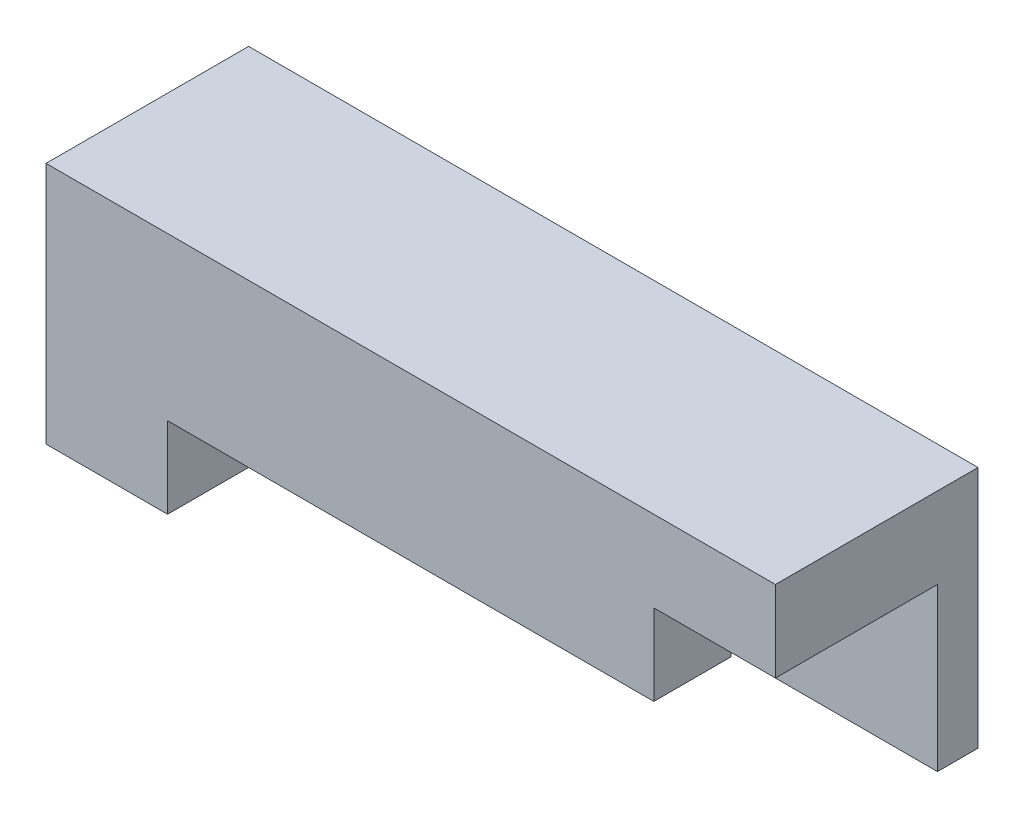
ISO-10303-21;
HEADER;
FILE_DESCRIPTION(('STEP AP214'),'2;1');
FILE_NAME('part.step','',(''),(''),'','','');
FILE_SCHEMA(('AUTOMOTIVE_DESIGN { 1 0 10303 214 1 1 1 1 }'));
ENDSEC;
DATA;
#1=APPLICATION_CONTEXT('core data for automotive mechanical design processes');
#2=APPLICATION_PROTOCOL_DEFINITION('international standard','automotive_design',2000,#1);
#3=PRODUCT_CONTEXT('',#1,'mechanical');
#4=PRODUCT('Part','Part','',(#3));
#5=PRODUCT_RELATED_PRODUCT_CATEGORY('part','',(#4));
#6=PRODUCT_DEFINITION_FORMATION('','',#4);
#7=PRODUCT_DEFINITION_CONTEXT('part definition',#1,'design');
#8=PRODUCT_DEFINITION('design','',#6,#7);
#9=PRODUCT_DEFINITION_SHAPE('','',#8);
#10=(LENGTH_UNIT() NAMED_UNIT(*) SI_UNIT(.MILLI.,.METRE.));
#11=(NAMED_UNIT(*) PLANE_ANGLE_UNIT() SI_UNIT($,.RADIAN.));
#12=(NAMED_UNIT(*) SI_UNIT($,.STERADIAN.) SOLID_ANGLE_UNIT());
#13=UNCERTAINTY_MEASURE_WITH_UNIT(LENGTH_MEASURE(1.E-05),#10,'distance_accuracy_value','');
#14=(GEOMETRIC_REPRESENTATION_CONTEXT(3) GLOBAL_UNCERTAINTY_ASSIGNED_CONTEXT((#13)) GLOBAL_UNIT_ASSIGNED_CONTEXT((#10,
#11,#12)) REPRESENTATION_CONTEXT('',''));
#15=CARTESIAN_POINT('',(0.,0.,0.));
#16=DIRECTION('',(0.,0.,1.));
#17=DIRECTION('',(1.,0.,0.));
#18=AXIS2_PLACEMENT_3D('',#15,#16,#17);
#19=CARTESIAN_POINT('',(9.,6.,2.5));
#20=DIRECTION('',(-1.,0.,0.));
#21=DIRECTION('',(0.,0.,1.));
#22=AXIS2_PLACEMENT_3D('',#19,#20,#21);
#23=PLANE('',#22);
#24=DIRECTION('',(0.,-1.,0.));
#25=VECTOR('',#24,1.);
#26=CARTESIAN_POINT('',(9.,6.,2.5));
#27=LINE('',#26,#25);
#28=CARTESIAN_POINT('',(9.,6.,2.5));
#29=VERTEX_POINT('',#28);
#30=CARTESIAN_POINT('',(9.,4.,2.5));
#31=VERTEX_POINT('',#30);
#32=EDGE_CURVE('E161',#29,#31,#27,.T.);
#33=ORIENTED_EDGE('',*,*,#32,.T.);
#34=DIRECTION('',(0.,0.,1.));
#35=VECTOR('',#34,1.);
#36=CARTESIAN_POINT('',(9.,4.,0.600000000000001));
#37=LINE('',#36,#35);
#38=CARTESIAN_POINT('',(9.,4.,-1.5));
#39=VERTEX_POINT('',#38);
#40=EDGE_CURVE('E143',#39,#31,#37,.T.);
#41=ORIENTED_EDGE('',*,*,#40,.F.);
#42=DIRECTION('',(0.,1.,0.));
#43=VECTOR('',#42,1.);
#44=CARTESIAN_POINT('',(9.,0.,-1.5));
#45=LINE('',#44,#43);
#46=CARTESIAN_POINT('',(9.,0.,-1.5));
#47=VERTEX_POINT('',#46);
#48=EDGE_CURVE('E63',#47,#39,#45,.T.);
#49=ORIENTED_EDGE('',*,*,#48,.F.);
#50=DIRECTION('',(0.,0.,-1.));
#51=VECTOR('',#50,1.);
#52=CARTESIAN_POINT('',(9.,0.,2.5));
#53=LINE('',#52,#51);
#54=CARTESIAN_POINT('',(9.,0.,-2.5));
#55=VERTEX_POINT('',#54);
#56=EDGE_CURVE('E154',#47,#55,#53,.T.);
#57=ORIENTED_EDGE('',*,*,#56,.T.);
#58=DIRECTION('',(0.,-1.,0.));
#59=VECTOR('',#58,1.);
#60=CARTESIAN_POINT('',(9.,6.,-2.5));
#61=LINE('',#60,#59);
#62=CARTESIAN_POINT('',(9.,6.,-2.5));
#63=VERTEX_POINT('',#62);
#64=EDGE_CURVE('E12',#63,#55,#61,.T.);
#65=ORIENTED_EDGE('',*,*,#64,.F.);
#66=DIRECTION('',(0.,0.,-1.));
#67=VECTOR('',#66,1.);
#68=CARTESIAN_POINT('',(9.,6.,2.5));
#69=LINE('',#68,#67);
#70=EDGE_CURVE('E155',#29,#63,#69,.T.);
#71=ORIENTED_EDGE('',*,*,#70,.F.);
#72=EDGE_LOOP('',(#33,#41,#49,#57,#65,#71));
#73=FACE_BOUND('',#72,.T.);
#74=ADVANCED_FACE('F43',(#73),#23,.F.);
#75=CARTESIAN_POINT('',(-9.,6.,2.5));
#76=DIRECTION('',(0.,0.,-1.));
#77=DIRECTION('',(-1.,0.,0.));
#78=AXIS2_PLACEMENT_3D('',#75,#76,#77);
#79=PLANE('',#78);
#80=DIRECTION('',(-1.,0.,0.));
#81=VECTOR('',#80,1.);
#82=CARTESIAN_POINT('',(6.,4.,2.5));
#83=LINE('',#82,#81);
#84=CARTESIAN_POINT('',(6.,4.,2.5));
#85=VERTEX_POINT('',#84);
#86=EDGE_CURVE('E130',#31,#85,#83,.T.);
#87=ORIENTED_EDGE('',*,*,#86,.F.);
#88=ORIENTED_EDGE('',*,*,#32,.F.);
#89=DIRECTION('',(1.,0.,0.));
#90=VECTOR('',#89,1.);
#91=CARTESIAN_POINT('',(-9.,6.,2.5));
#92=LINE('',#91,#90);
#93=CARTESIAN_POINT('',(-9.,6.,2.5));
#94=VERTEX_POINT('',#93);
#95=EDGE_CURVE('E163',#94,#29,#92,.T.);
#96=ORIENTED_EDGE('',*,*,#95,.F.);
#97=DIRECTION('',(0.,-1.,0.));
#98=VECTOR('',#97,1.);
#99=CARTESIAN_POINT('',(-9.,6.,2.5));
#100=LINE('',#99,#98);
#101=CARTESIAN_POINT('',(-9.,0.,2.5));
#102=VERTEX_POINT('',#101);
#103=EDGE_CURVE('E173',#94,#102,#100,.T.);
#104=ORIENTED_EDGE('',*,*,#103,.T.);
#105=DIRECTION('',(1.,0.,0.));
#106=VECTOR('',#105,1.);
#107=CARTESIAN_POINT('',(-9.,0.,2.5));
#108=LINE('',#107,#106);
#109=CARTESIAN_POINT('',(-6.,0.,2.50000000000001));
#110=VERTEX_POINT('',#109);
#111=EDGE_CURVE('E159',#102,#110,#108,.T.);
#112=ORIENTED_EDGE('',*,*,#111,.T.);
#113=DIRECTION('',(0.,1.,0.));
#114=VECTOR('',#113,1.);
#115=CARTESIAN_POINT('',(-6.,2.,2.50000000000001));
#116=LINE('',#115,#114);
#117=CARTESIAN_POINT('',(-6.,2.,2.50000000000001));
#118=VERTEX_POINT('',#117);
#119=EDGE_CURVE('E199',#110,#118,#116,.T.);
#120=ORIENTED_EDGE('',*,*,#119,.T.);
#121=DIRECTION('',(1.,0.,0.));
#122=VECTOR('',#121,1.);
#123=CARTESIAN_POINT('',(-14.6568542494924,2.,2.50000000000001));
#124=LINE('',#123,#122);
#125=CARTESIAN_POINT('',(6.,2.,2.5));
#126=VERTEX_POINT('',#125);
#127=EDGE_CURVE('E141',#118,#126,#124,.T.);
#128=ORIENTED_EDGE('',*,*,#127,.T.);
#129=DIRECTION('',(0.,-1.,0.));
#130=VECTOR('',#129,1.);
#131=CARTESIAN_POINT('',(6.,4.,2.5));
#132=LINE('',#131,#130);
#133=EDGE_CURVE('E126',#85,#126,#132,.T.);
#134=ORIENTED_EDGE('',*,*,#133,.F.);
#135=EDGE_LOOP('',(#87,#88,#96,#104,#112,#120,#128,#134));
#136=FACE_BOUND('',#135,.T.);
#137=ADVANCED_FACE('F191',(#136),#79,.F.);
#138=CARTESIAN_POINT('',(-14.6568542494924,4.,0.600000000000013));
#139=DIRECTION('',(0.,0.,1.));
#140=DIRECTION('',(1.,0.,0.));
#141=AXIS2_PLACEMENT_3D('',#138,#139,#140);
#142=PLANE('',#141);
#143=DIRECTION('',(0.,1.,0.));
#144=VECTOR('',#143,1.);
#145=CARTESIAN_POINT('',(6.,4.,0.600000000000002));
#146=LINE('',#145,#144);
#147=CARTESIAN_POINT('',(5.99999999999999,2.,0.600000000000002));
#148=VERTEX_POINT('',#147);
#149=CARTESIAN_POINT('',(6.,4.,0.600000000000001));
#150=VERTEX_POINT('',#149);
#151=EDGE_CURVE('E134',#148,#150,#146,.T.);
#152=ORIENTED_EDGE('',*,*,#151,.F.);
#153=DIRECTION('',(1.,0.,0.));
#154=VECTOR('',#153,1.);
#155=CARTESIAN_POINT('',(-14.6568542494924,2.,0.600000000000013));
#156=LINE('',#155,#154);
#157=CARTESIAN_POINT('',(-6.,2.,0.600000000000008));
#158=VERTEX_POINT('',#157);
#159=EDGE_CURVE('E138',#158,#148,#156,.T.);
#160=ORIENTED_EDGE('',*,*,#159,.F.);
#161=DIRECTION('',(0.,1.,0.));
#162=VECTOR('',#161,1.);
#163=CARTESIAN_POINT('',(-6.,4.,0.600000000000009));
#164=LINE('',#163,#162);
#165=CARTESIAN_POINT('',(-6.,4.,0.600000000000009));
#166=VERTEX_POINT('',#165);
#167=EDGE_CURVE('E136',#158,#166,#164,.T.);
#168=ORIENTED_EDGE('',*,*,#167,.T.);
#169=DIRECTION('',(1.,0.,0.));
#170=VECTOR('',#169,1.);
#171=CARTESIAN_POINT('',(-14.6568542494924,4.,0.600000000000013));
#172=LINE('',#171,#170);
#173=EDGE_CURVE('E121',#166,#150,#172,.T.);
#174=ORIENTED_EDGE('',*,*,#173,.T.);
#175=EDGE_LOOP('',(#152,#160,#168,#174));
#176=FACE_BOUND('',#175,.T.);
#177=ADVANCED_FACE('F139',(#176),#142,.F.);
#178=CARTESIAN_POINT('',(0.,0.,0.));
#179=DIRECTION('',(0.,-1.,0.));
#180=DIRECTION('',(0.,0.,-1.));
#181=AXIS2_PLACEMENT_3D('',#178,#179,#180);
#182=PLANE('',#181);
#183=DIRECTION('',(1.,0.,0.));
#184=VECTOR('',#183,1.);
#185=CARTESIAN_POINT('',(-14.6568542494924,0.,-1.49999999999999));
#186=LINE('',#185,#184);
#187=CARTESIAN_POINT('',(-6.,0.,-1.5));
#188=VERTEX_POINT('',#187);
#189=EDGE_CURVE('E207',#188,#47,#186,.T.);
#190=ORIENTED_EDGE('',*,*,#189,.F.);
#191=DIRECTION('',(0.,0.,1.));
#192=VECTOR('',#191,1.);
#193=CARTESIAN_POINT('',(-6.,0.,2.50000000000001));
#194=LINE('',#193,#192);
#195=EDGE_CURVE('E192',#188,#110,#194,.T.);
#196=ORIENTED_EDGE('',*,*,#195,.T.);
#197=ORIENTED_EDGE('',*,*,#111,.F.);
#198=DIRECTION('',(0.,0.,1.));
#199=VECTOR('',#198,1.);
#200=CARTESIAN_POINT('',(-9.,0.,2.5));
#201=LINE('',#200,#199);
#202=CARTESIAN_POINT('',(-9.,0.,-2.5));
#203=VERTEX_POINT('',#202);
#204=EDGE_CURVE('E170',#203,#102,#201,.T.);
#205=ORIENTED_EDGE('',*,*,#204,.F.);
#206=DIRECTION('',(-1.,0.,0.));
#207=VECTOR('',#206,1.);
#208=CARTESIAN_POINT('',(-9.,0.,-2.5));
#209=LINE('',#208,#207);
#210=EDGE_CURVE('E164',#55,#203,#209,.T.);
#211=ORIENTED_EDGE('',*,*,#210,.F.);
#212=ORIENTED_EDGE('',*,*,#56,.F.);
#213=EDGE_LOOP('',(#190,#196,#197,#205,#211,#212));
#214=FACE_BOUND('',#213,.T.);
#215=ADVANCED_FACE('F190',(#214),#182,.T.);
#216=CARTESIAN_POINT('',(-9.,6.,-2.5));
#217=DIRECTION('',(0.,0.,1.));
#218=DIRECTION('',(1.,0.,0.));
#219=AXIS2_PLACEMENT_3D('',#216,#217,#218);
#220=PLANE('',#219);
#221=ORIENTED_EDGE('',*,*,#210,.T.);
#222=DIRECTION('',(0.,-1.,0.));
#223=VECTOR('',#222,1.);
#224=CARTESIAN_POINT('',(-9.,6.,-2.5));
#225=LINE('',#224,#223);
#226=CARTESIAN_POINT('',(-9.,6.,-2.5));
#227=VERTEX_POINT('',#226);
#228=EDGE_CURVE('E49',#227,#203,#225,.T.);
#229=ORIENTED_EDGE('',*,*,#228,.F.);
#230=DIRECTION('',(-1.,0.,0.));
#231=VECTOR('',#230,1.);
#232=CARTESIAN_POINT('',(-9.,6.,-2.5));
#233=LINE('',#232,#231);
#234=EDGE_CURVE('E157',#63,#227,#233,.T.);
#235=ORIENTED_EDGE('',*,*,#234,.F.);
#236=ORIENTED_EDGE('',*,*,#64,.T.);
#237=EDGE_LOOP('',(#221,#229,#235,#236));
#238=FACE_BOUND('',#237,.T.);
#239=ADVANCED_FACE('F205',(#238),#220,.F.);
#240=CARTESIAN_POINT('',(-9.,6.,2.5));
#241=DIRECTION('',(1.,0.,0.));
#242=DIRECTION('',(0.,0.,-1.));
#243=AXIS2_PLACEMENT_3D('',#240,#241,#242);
#244=PLANE('',#243);
#245=ORIENTED_EDGE('',*,*,#204,.T.);
#246=ORIENTED_EDGE('',*,*,#103,.F.);
#247=DIRECTION('',(0.,0.,1.));
#248=VECTOR('',#247,1.);
#249=CARTESIAN_POINT('',(-9.,6.,2.5));
#250=LINE('',#249,#248);
#251=EDGE_CURVE('E156',#227,#94,#250,.T.);
#252=ORIENTED_EDGE('',*,*,#251,.F.);
#253=ORIENTED_EDGE('',*,*,#228,.T.);
#254=EDGE_LOOP('',(#245,#246,#252,#253));
#255=FACE_BOUND('',#254,.T.);
#256=ADVANCED_FACE('F179',(#255),#244,.F.);
#257=CARTESIAN_POINT('',(0.,6.,0.));
#258=DIRECTION('',(0.,-1.,0.));
#259=DIRECTION('',(0.,0.,-1.));
#260=AXIS2_PLACEMENT_3D('',#257,#258,#259);
#261=PLANE('',#260);
#262=ORIENTED_EDGE('',*,*,#70,.T.);
#263=ORIENTED_EDGE('',*,*,#234,.T.);
#264=ORIENTED_EDGE('',*,*,#251,.T.);
#265=ORIENTED_EDGE('',*,*,#95,.T.);
#266=EDGE_LOOP('',(#262,#263,#264,#265));
#267=FACE_BOUND('',#266,.T.);
#268=ADVANCED_FACE('F202',(#267),#261,.F.);
#269=CARTESIAN_POINT('',(-14.6568542494924,0.,-1.49999999999999));
#270=DIRECTION('',(0.,0.,-1.));
#271=DIRECTION('',(-1.,0.,0.));
#272=AXIS2_PLACEMENT_3D('',#269,#270,#271);
#273=PLANE('',#272);
#274=DIRECTION('',(0.,-1.,0.));
#275=VECTOR('',#274,1.);
#276=CARTESIAN_POINT('',(-6.,0.,-1.49999999999999));
#277=LINE('',#276,#275);
#278=CARTESIAN_POINT('',(-6.,4.,-1.5));
#279=VERTEX_POINT('',#278);
#280=EDGE_CURVE('E151',#279,#188,#277,.T.);
#281=ORIENTED_EDGE('',*,*,#280,.T.);
#282=ORIENTED_EDGE('',*,*,#189,.T.);
#283=ORIENTED_EDGE('',*,*,#48,.T.);
#284=DIRECTION('',(1.,0.,0.));
#285=VECTOR('',#284,1.);
#286=CARTESIAN_POINT('',(-14.6568542494924,4.,-1.49999999999999));
#287=LINE('',#286,#285);
#288=EDGE_CURVE('E142',#279,#39,#287,.T.);
#289=ORIENTED_EDGE('',*,*,#288,.F.);
#290=EDGE_LOOP('',(#281,#282,#283,#289));
#291=FACE_BOUND('',#290,.T.);
#292=ADVANCED_FACE('F223',(#291),#273,.F.);
#293=CARTESIAN_POINT('',(-14.6568542494924,2.,0.600000000000013));
#294=DIRECTION('',(0.,1.,0.));
#295=DIRECTION('',(0.,0.,1.));
#296=AXIS2_PLACEMENT_3D('',#293,#294,#295);
#297=PLANE('',#296);
#298=ORIENTED_EDGE('',*,*,#159,.T.);
#299=DIRECTION('',(0.,0.,1.));
#300=VECTOR('',#299,1.);
#301=CARTESIAN_POINT('',(6.,2.,-2.501));
#302=LINE('',#301,#300);
#303=EDGE_CURVE('E60',#148,#126,#302,.T.);
#304=ORIENTED_EDGE('',*,*,#303,.T.);
#305=ORIENTED_EDGE('',*,*,#127,.F.);
#306=DIRECTION('',(0.,0.,-1.));
#307=VECTOR('',#306,1.);
#308=CARTESIAN_POINT('',(-6.,2.,0.600000000000013));
#309=LINE('',#308,#307);
#310=EDGE_CURVE('E206',#118,#158,#309,.T.);
#311=ORIENTED_EDGE('',*,*,#310,.T.);
#312=EDGE_LOOP('',(#298,#304,#305,#311));
#313=FACE_BOUND('',#312,.T.);
#314=ADVANCED_FACE('F222',(#313),#297,.F.);
#315=CARTESIAN_POINT('',(-14.6568542494924,4.,0.600000000000013));
#316=DIRECTION('',(0.,1.,0.));
#317=DIRECTION('',(0.,0.,1.));
#318=AXIS2_PLACEMENT_3D('',#315,#316,#317);
#319=PLANE('',#318);
#320=DIRECTION('',(0.,0.,-1.));
#321=VECTOR('',#320,1.);
#322=CARTESIAN_POINT('',(-6.,4.,0.600000000000013));
#323=LINE('',#322,#321);
#324=EDGE_CURVE('E146',#166,#279,#323,.T.);
#325=ORIENTED_EDGE('',*,*,#324,.T.);
#326=ORIENTED_EDGE('',*,*,#288,.T.);
#327=ORIENTED_EDGE('',*,*,#40,.T.);
#328=ORIENTED_EDGE('',*,*,#86,.T.);
#329=DIRECTION('',(0.,0.,1.));
#330=VECTOR('',#329,1.);
#331=CARTESIAN_POINT('',(6.,4.,-2.501));
#332=LINE('',#331,#330);
#333=EDGE_CURVE('E122',#150,#85,#332,.T.);
#334=ORIENTED_EDGE('',*,*,#333,.F.);
#335=ORIENTED_EDGE('',*,*,#173,.F.);
#336=EDGE_LOOP('',(#325,#326,#327,#328,#334,#335));
#337=FACE_BOUND('',#336,.T.);
#338=ADVANCED_FACE('F125',(#337),#319,.F.);
#339=CARTESIAN_POINT('',(-6.,6.,2.5));
#340=DIRECTION('',(1.,0.,0.));
#341=DIRECTION('',(0.,0.,-1.));
#342=AXIS2_PLACEMENT_3D('',#339,#340,#341);
#343=PLANE('',#342);
#344=ORIENTED_EDGE('',*,*,#280,.F.);
#345=ORIENTED_EDGE('',*,*,#324,.F.);
#346=ORIENTED_EDGE('',*,*,#167,.F.);
#347=ORIENTED_EDGE('',*,*,#310,.F.);
#348=ORIENTED_EDGE('',*,*,#119,.F.);
#349=ORIENTED_EDGE('',*,*,#195,.F.);
#350=EDGE_LOOP('',(#344,#345,#346,#347,#348,#349));
#351=FACE_BOUND('',#350,.T.);
#352=ADVANCED_FACE('F221',(#351),#343,.T.);
#353=CARTESIAN_POINT('',(6.,4.,-2.501));
#354=DIRECTION('',(-1.,0.,0.));
#355=DIRECTION('',(0.,-1.,0.));
#356=AXIS2_PLACEMENT_3D('',#353,#354,#355);
#357=PLANE('',#356);
#358=ORIENTED_EDGE('',*,*,#151,.T.);
#359=ORIENTED_EDGE('',*,*,#333,.T.);
#360=ORIENTED_EDGE('',*,*,#133,.T.);
#361=ORIENTED_EDGE('',*,*,#303,.F.);
#362=EDGE_LOOP('',(#358,#359,#360,#361));
#363=FACE_BOUND('',#362,.T.);
#364=ADVANCED_FACE('F131',(#363),#357,.F.);
#365=CLOSED_SHELL('',(#74,#137,#177,#215,#239,#256,#268,#292,#314,#338,#352,#364));
#366=MANIFOLD_SOLID_BREP('B2',#365);
#367=ADVANCED_BREP_SHAPE_REPRESENTATION('',(#18,#366),#14);
#368=SHAPE_DEFINITION_REPRESENTATION(#9,#367);
ENDSEC;
END-ISO-10303-21;
